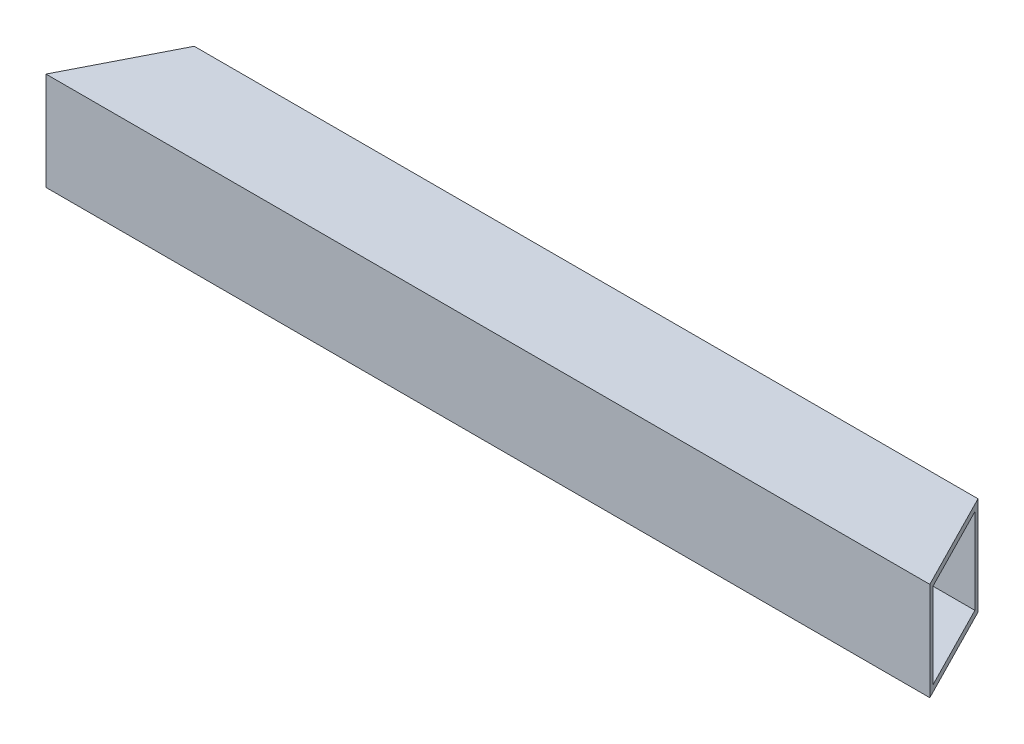
ISO-10303-21;
HEADER;
FILE_DESCRIPTION(('STEP AP214'),'2;1');
FILE_NAME('part.step','',(''),(''),'','','');
FILE_SCHEMA(('AUTOMOTIVE_DESIGN { 1 0 10303 214 1 1 1 1 }'));
ENDSEC;
DATA;
#1=APPLICATION_CONTEXT('core data for automotive mechanical design processes');
#2=APPLICATION_PROTOCOL_DEFINITION('international standard','automotive_design',2000,#1);
#3=PRODUCT_CONTEXT('',#1,'mechanical');
#4=PRODUCT('Part','Part','',(#3));
#5=PRODUCT_RELATED_PRODUCT_CATEGORY('part','',(#4));
#6=PRODUCT_DEFINITION_FORMATION('','',#4);
#7=PRODUCT_DEFINITION_CONTEXT('part definition',#1,'design');
#8=PRODUCT_DEFINITION('design','',#6,#7);
#9=PRODUCT_DEFINITION_SHAPE('','',#8);
#10=(LENGTH_UNIT() NAMED_UNIT(*) SI_UNIT(.MILLI.,.METRE.));
#11=(NAMED_UNIT(*) PLANE_ANGLE_UNIT() SI_UNIT($,.RADIAN.));
#12=(NAMED_UNIT(*) SI_UNIT($,.STERADIAN.) SOLID_ANGLE_UNIT());
#13=UNCERTAINTY_MEASURE_WITH_UNIT(LENGTH_MEASURE(1.E-05),#10,'distance_accuracy_value','');
#14=(GEOMETRIC_REPRESENTATION_CONTEXT(3) GLOBAL_UNCERTAINTY_ASSIGNED_CONTEXT((#13)) GLOBAL_UNIT_ASSIGNED_CONTEXT((#10,
#11,#12)) REPRESENTATION_CONTEXT('',''));
#15=CARTESIAN_POINT('',(0.,0.,0.));
#16=DIRECTION('',(0.,0.,1.));
#17=DIRECTION('',(1.,0.,0.));
#18=AXIS2_PLACEMENT_3D('',#15,#16,#17);
#19=CARTESIAN_POINT('',(114.3,-673.1,12.6999999999999));
#20=DIRECTION('',(-0.891006524188371,0.,0.453990499739541));
#21=DIRECTION('',(0.453990499739541,0.,0.891006524188371));
#22=AXIS2_PLACEMENT_3D('',#19,#20,#21);
#23=PLANE('',#22);
#24=DIRECTION('',(-0.453990499739541,0.,-0.891006524188371));
#25=VECTOR('',#24,1.);
#26=CARTESIAN_POINT('',(104.025484171438,-12.7,-7.46487270411454));
#27=LINE('',#26,#25);
#28=CARTESIAN_POINT('',(114.3,-12.7,12.7));
#29=VERTEX_POINT('',#28);
#30=CARTESIAN_POINT('',(101.358053582842,-12.7,-12.7));
#31=VERTEX_POINT('',#30);
#32=EDGE_CURVE('E105',#29,#31,#27,.T.);
#33=ORIENTED_EDGE('',*,*,#32,.T.);
#34=DIRECTION('',(0.,1.,0.));
#35=VECTOR('',#34,1.);
#36=CARTESIAN_POINT('',(101.358053582842,-673.1,-12.7000000000001));
#37=LINE('',#36,#35);
#38=CARTESIAN_POINT('',(101.358053582842,12.7,-12.7));
#39=VERTEX_POINT('',#38);
#40=EDGE_CURVE('E162',#31,#39,#37,.T.);
#41=ORIENTED_EDGE('',*,*,#40,.T.);
#42=DIRECTION('',(0.453990499739541,0.,0.891006524188371));
#43=VECTOR('',#42,1.);
#44=CARTESIAN_POINT('',(114.3,12.7,12.7));
#45=LINE('',#44,#43);
#46=CARTESIAN_POINT('',(114.3,12.7,12.7));
#47=VERTEX_POINT('',#46);
#48=EDGE_CURVE('E149',#39,#47,#45,.T.);
#49=ORIENTED_EDGE('',*,*,#48,.T.);
#50=DIRECTION('',(0.,1.,0.));
#51=VECTOR('',#50,1.);
#52=CARTESIAN_POINT('',(114.3,-12.7,12.7));
#53=LINE('',#52,#51);
#54=EDGE_CURVE('E104',#29,#47,#53,.T.);
#55=ORIENTED_EDGE('',*,*,#54,.F.);
#56=EDGE_LOOP('',(#33,#41,#49,#55));
#57=FACE_BOUND('',#56,.T.);
#58=DIRECTION('',(0.453990499739541,0.,0.891006524188371));
#59=VECTOR('',#58,1.);
#60=CARTESIAN_POINT('',(114.3,11.049,12.6999999999999));
#61=LINE('',#60,#59);
#62=CARTESIAN_POINT('',(102.199280099957,11.049,-11.049));
#63=VERTEX_POINT('',#62);
#64=CARTESIAN_POINT('',(113.458773482885,11.049,11.049));
#65=VERTEX_POINT('',#64);
#66=EDGE_CURVE('E42',#63,#65,#61,.T.);
#67=ORIENTED_EDGE('',*,*,#66,.F.);
#68=DIRECTION('',(0.,1.,0.));
#69=VECTOR('',#68,1.);
#70=CARTESIAN_POINT('',(102.199280099957,-673.1,-11.049));
#71=LINE('',#70,#69);
#72=CARTESIAN_POINT('',(102.199280099957,-11.049,-11.049));
#73=VERTEX_POINT('',#72);
#74=EDGE_CURVE('E118',#73,#63,#71,.T.);
#75=ORIENTED_EDGE('',*,*,#74,.F.);
#76=DIRECTION('',(0.453990499739541,0.,0.891006524188371));
#77=VECTOR('',#76,1.);
#78=CARTESIAN_POINT('',(114.3,-11.049,12.6999999999999));
#79=LINE('',#78,#77);
#80=CARTESIAN_POINT('',(113.458773482885,-11.049,11.049));
#81=VERTEX_POINT('',#80);
#82=EDGE_CURVE('E121',#73,#81,#79,.T.);
#83=ORIENTED_EDGE('',*,*,#82,.T.);
#84=DIRECTION('',(0.,1.,0.));
#85=VECTOR('',#84,1.);
#86=CARTESIAN_POINT('',(113.458773482885,-673.1,11.049));
#87=LINE('',#86,#85);
#88=EDGE_CURVE('E129',#81,#65,#87,.T.);
#89=ORIENTED_EDGE('',*,*,#88,.T.);
#90=EDGE_LOOP('',(#67,#75,#83,#89));
#91=FACE_BOUND('',#90,.T.);
#92=ADVANCED_FACE('F34',(#57,#91),#23,.F.);
#93=CARTESIAN_POINT('',(114.3,12.7,-12.7));
#94=DIRECTION('',(0.,-1.,0.));
#95=DIRECTION('',(0.,0.,-1.));
#96=AXIS2_PLACEMENT_3D('',#93,#94,#95);
#97=PLANE('',#96);
#98=DIRECTION('',(-1.,0.,0.));
#99=VECTOR('',#98,1.);
#100=CARTESIAN_POINT('',(114.3,12.7,-12.7));
#101=LINE('',#100,#99);
#102=CARTESIAN_POINT('',(-101.358053582842,12.7,-12.7));
#103=VERTEX_POINT('',#102);
#104=EDGE_CURVE('E114',#39,#103,#101,.T.);
#105=ORIENTED_EDGE('',*,*,#104,.T.);
#106=DIRECTION('',(0.453990499739541,0.,-0.891006524188371));
#107=VECTOR('',#106,1.);
#108=CARTESIAN_POINT('',(-114.3,12.7,12.7));
#109=LINE('',#108,#107);
#110=CARTESIAN_POINT('',(-114.3,12.7,12.7));
#111=VERTEX_POINT('',#110);
#112=EDGE_CURVE('E49',#111,#103,#109,.T.);
#113=ORIENTED_EDGE('',*,*,#112,.F.);
#114=DIRECTION('',(-1.,0.,0.));
#115=VECTOR('',#114,1.);
#116=CARTESIAN_POINT('',(114.3,12.7,12.7));
#117=LINE('',#116,#115);
#118=EDGE_CURVE('E111',#47,#111,#117,.T.);
#119=ORIENTED_EDGE('',*,*,#118,.F.);
#120=ORIENTED_EDGE('',*,*,#48,.F.);
#121=EDGE_LOOP('',(#105,#113,#119,#120));
#122=FACE_BOUND('',#121,.T.);
#123=ADVANCED_FACE('F36',(#122),#97,.F.);
#124=CARTESIAN_POINT('',(114.3,-12.7,12.7));
#125=DIRECTION('',(0.,0.,1.));
#126=DIRECTION('',(1.,0.,0.));
#127=AXIS2_PLACEMENT_3D('',#124,#125,#126);
#128=PLANE('',#127);
#129=DIRECTION('',(0.,1.,0.));
#130=VECTOR('',#129,1.);
#131=CARTESIAN_POINT('',(-114.3,-12.7,12.7));
#132=LINE('',#131,#130);
#133=CARTESIAN_POINT('',(-114.3,-12.7,12.7));
#134=VERTEX_POINT('',#133);
#135=EDGE_CURVE('E96',#134,#111,#132,.T.);
#136=ORIENTED_EDGE('',*,*,#135,.F.);
#137=DIRECTION('',(-1.,0.,0.));
#138=VECTOR('',#137,1.);
#139=CARTESIAN_POINT('',(114.3,-12.7,12.7));
#140=LINE('',#139,#138);
#141=EDGE_CURVE('E119',#29,#134,#140,.T.);
#142=ORIENTED_EDGE('',*,*,#141,.F.);
#143=ORIENTED_EDGE('',*,*,#54,.T.);
#144=ORIENTED_EDGE('',*,*,#118,.T.);
#145=EDGE_LOOP('',(#136,#142,#143,#144));
#146=FACE_BOUND('',#145,.T.);
#147=ADVANCED_FACE('F117',(#146),#128,.T.);
#148=CARTESIAN_POINT('',(114.3,-12.7,-12.7));
#149=DIRECTION('',(0.,-1.,0.));
#150=DIRECTION('',(0.,0.,-1.));
#151=AXIS2_PLACEMENT_3D('',#148,#149,#150);
#152=PLANE('',#151);
#153=DIRECTION('',(-0.453990499739541,0.,0.891006524188371));
#154=VECTOR('',#153,1.);
#155=CARTESIAN_POINT('',(-56.9093385084691,-12.7,-99.9355151611702));
#156=LINE('',#155,#154);
#157=CARTESIAN_POINT('',(-101.358053582842,-12.7,-12.7));
#158=VERTEX_POINT('',#157);
#159=EDGE_CURVE('E99',#158,#134,#156,.T.);
#160=ORIENTED_EDGE('',*,*,#159,.F.);
#161=DIRECTION('',(-1.,0.,0.));
#162=VECTOR('',#161,1.);
#163=CARTESIAN_POINT('',(114.3,-12.7,-12.7));
#164=LINE('',#163,#162);
#165=EDGE_CURVE('E123',#31,#158,#164,.T.);
#166=ORIENTED_EDGE('',*,*,#165,.F.);
#167=ORIENTED_EDGE('',*,*,#32,.F.);
#168=ORIENTED_EDGE('',*,*,#141,.T.);
#169=EDGE_LOOP('',(#160,#166,#167,#168));
#170=FACE_BOUND('',#169,.T.);
#171=ADVANCED_FACE('F173',(#170),#152,.T.);
#172=CARTESIAN_POINT('',(114.3,-12.7,-12.7));
#173=DIRECTION('',(0.,0.,1.));
#174=DIRECTION('',(1.,0.,0.));
#175=AXIS2_PLACEMENT_3D('',#172,#173,#174);
#176=PLANE('',#175);
#177=ORIENTED_EDGE('',*,*,#165,.T.);
#178=DIRECTION('',(0.,1.,0.));
#179=VECTOR('',#178,1.);
#180=CARTESIAN_POINT('',(-101.358053582842,-673.1,-12.7000000000001));
#181=LINE('',#180,#179);
#182=EDGE_CURVE('E115',#158,#103,#181,.T.);
#183=ORIENTED_EDGE('',*,*,#182,.T.);
#184=ORIENTED_EDGE('',*,*,#104,.F.);
#185=ORIENTED_EDGE('',*,*,#40,.F.);
#186=EDGE_LOOP('',(#177,#183,#184,#185));
#187=FACE_BOUND('',#186,.T.);
#188=ADVANCED_FACE('F170',(#187),#176,.F.);
#189=CARTESIAN_POINT('',(114.3,11.049,-11.049));
#190=DIRECTION('',(0.,-1.,0.));
#191=DIRECTION('',(0.,0.,-1.));
#192=AXIS2_PLACEMENT_3D('',#189,#190,#191);
#193=PLANE('',#192);
#194=DIRECTION('',(-0.453990499739541,0.,0.891006524188371));
#195=VECTOR('',#194,1.);
#196=CARTESIAN_POINT('',(-57.5771820373256,11.049,-98.6247984354027));
#197=LINE('',#196,#195);
#198=CARTESIAN_POINT('',(-102.199280099957,11.049,-11.049));
#199=VERTEX_POINT('',#198);
#200=CARTESIAN_POINT('',(-113.458773482885,11.049,11.049));
#201=VERTEX_POINT('',#200);
#202=EDGE_CURVE('E174',#199,#201,#197,.T.);
#203=ORIENTED_EDGE('',*,*,#202,.F.);
#204=DIRECTION('',(-1.,0.,0.));
#205=VECTOR('',#204,1.);
#206=CARTESIAN_POINT('',(114.3,11.049,-11.049));
#207=LINE('',#206,#205);
#208=EDGE_CURVE('E140',#63,#199,#207,.T.);
#209=ORIENTED_EDGE('',*,*,#208,.F.);
#210=ORIENTED_EDGE('',*,*,#66,.T.);
#211=DIRECTION('',(-1.,0.,0.));
#212=VECTOR('',#211,1.);
#213=CARTESIAN_POINT('',(114.3,11.049,11.049));
#214=LINE('',#213,#212);
#215=EDGE_CURVE('E138',#65,#201,#214,.T.);
#216=ORIENTED_EDGE('',*,*,#215,.T.);
#217=EDGE_LOOP('',(#203,#209,#210,#216));
#218=FACE_BOUND('',#217,.T.);
#219=ADVANCED_FACE('F137',(#218),#193,.T.);
#220=CARTESIAN_POINT('',(114.3,-11.049,11.049));
#221=DIRECTION('',(0.,0.,1.));
#222=DIRECTION('',(1.,0.,0.));
#223=AXIS2_PLACEMENT_3D('',#220,#221,#222);
#224=PLANE('',#223);
#225=DIRECTION('',(-1.,0.,0.));
#226=VECTOR('',#225,1.);
#227=CARTESIAN_POINT('',(114.3,-11.049,11.049));
#228=LINE('',#227,#226);
#229=CARTESIAN_POINT('',(-113.458773482885,-11.049,11.049));
#230=VERTEX_POINT('',#229);
#231=EDGE_CURVE('E150',#81,#230,#228,.T.);
#232=ORIENTED_EDGE('',*,*,#231,.T.);
#233=DIRECTION('',(0.,1.,0.));
#234=VECTOR('',#233,1.);
#235=CARTESIAN_POINT('',(-113.458773482885,-11.049,11.049));
#236=LINE('',#235,#234);
#237=EDGE_CURVE('E148',#230,#201,#236,.T.);
#238=ORIENTED_EDGE('',*,*,#237,.T.);
#239=ORIENTED_EDGE('',*,*,#215,.F.);
#240=ORIENTED_EDGE('',*,*,#88,.F.);
#241=EDGE_LOOP('',(#232,#238,#239,#240));
#242=FACE_BOUND('',#241,.T.);
#243=ADVANCED_FACE('F146',(#242),#224,.F.);
#244=CARTESIAN_POINT('',(114.3,-11.049,-11.049));
#245=DIRECTION('',(0.,-1.,0.));
#246=DIRECTION('',(0.,0.,-1.));
#247=AXIS2_PLACEMENT_3D('',#244,#245,#246);
#248=PLANE('',#247);
#249=DIRECTION('',(-1.,0.,0.));
#250=VECTOR('',#249,1.);
#251=CARTESIAN_POINT('',(114.3,-11.049,-11.049));
#252=LINE('',#251,#250);
#253=CARTESIAN_POINT('',(-102.199280099957,-11.049,-11.049));
#254=VERTEX_POINT('',#253);
#255=EDGE_CURVE('E156',#73,#254,#252,.T.);
#256=ORIENTED_EDGE('',*,*,#255,.T.);
#257=DIRECTION('',(-0.453990499739541,0.,0.891006524188371));
#258=VECTOR('',#257,1.);
#259=CARTESIAN_POINT('',(-57.5771820373257,-11.049,-98.6247984354027));
#260=LINE('',#259,#258);
#261=EDGE_CURVE('E56',#254,#230,#260,.T.);
#262=ORIENTED_EDGE('',*,*,#261,.T.);
#263=ORIENTED_EDGE('',*,*,#231,.F.);
#264=ORIENTED_EDGE('',*,*,#82,.F.);
#265=EDGE_LOOP('',(#256,#262,#263,#264));
#266=FACE_BOUND('',#265,.T.);
#267=ADVANCED_FACE('F155',(#266),#248,.F.);
#268=CARTESIAN_POINT('',(114.3,-11.049,-11.049));
#269=DIRECTION('',(0.,0.,1.));
#270=DIRECTION('',(1.,0.,0.));
#271=AXIS2_PLACEMENT_3D('',#268,#269,#270);
#272=PLANE('',#271);
#273=DIRECTION('',(0.,1.,0.));
#274=VECTOR('',#273,1.);
#275=CARTESIAN_POINT('',(-102.199280099957,-11.049,-11.049));
#276=LINE('',#275,#274);
#277=EDGE_CURVE('E11',#254,#199,#276,.T.);
#278=ORIENTED_EDGE('',*,*,#277,.F.);
#279=ORIENTED_EDGE('',*,*,#255,.F.);
#280=ORIENTED_EDGE('',*,*,#74,.T.);
#281=ORIENTED_EDGE('',*,*,#208,.T.);
#282=EDGE_LOOP('',(#278,#279,#280,#281));
#283=FACE_BOUND('',#282,.T.);
#284=ADVANCED_FACE('F181',(#283),#272,.T.);
#285=CARTESIAN_POINT('',(-114.3,-673.1,12.6999999999999));
#286=DIRECTION('',(0.891006524188371,0.,0.453990499739541));
#287=DIRECTION('',(0.453990499739541,0.,-0.891006524188371));
#288=AXIS2_PLACEMENT_3D('',#285,#286,#287);
#289=PLANE('',#288);
#290=ORIENTED_EDGE('',*,*,#159,.T.);
#291=ORIENTED_EDGE('',*,*,#135,.T.);
#292=ORIENTED_EDGE('',*,*,#112,.T.);
#293=ORIENTED_EDGE('',*,*,#182,.F.);
#294=EDGE_LOOP('',(#290,#291,#292,#293));
#295=FACE_BOUND('',#294,.T.);
#296=ORIENTED_EDGE('',*,*,#202,.T.);
#297=ORIENTED_EDGE('',*,*,#237,.F.);
#298=ORIENTED_EDGE('',*,*,#261,.F.);
#299=ORIENTED_EDGE('',*,*,#277,.T.);
#300=EDGE_LOOP('',(#296,#297,#298,#299));
#301=FACE_BOUND('',#300,.T.);
#302=ADVANCED_FACE('F97',(#295,#301),#289,.F.);
#303=CLOSED_SHELL('',(#92,#123,#147,#171,#188,#219,#243,#267,#284,#302));
#304=MANIFOLD_SOLID_BREP('B2',#303);
#305=ADVANCED_BREP_SHAPE_REPRESENTATION('',(#18,#304),#14);
#306=SHAPE_DEFINITION_REPRESENTATION(#9,#305);
ENDSEC;
END-ISO-10303-21;
